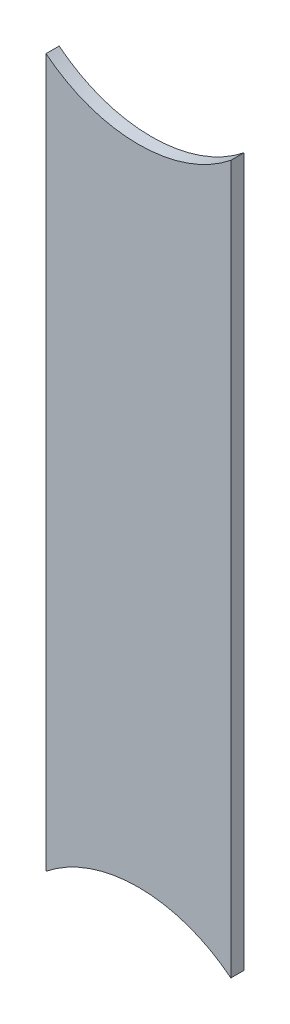
ISO-10303-21;
HEADER;
FILE_DESCRIPTION(('STEP AP214'),'2;1');
FILE_NAME('part.step','',(''),(''),'','','');
FILE_SCHEMA(('AUTOMOTIVE_DESIGN { 1 0 10303 214 1 1 1 1 }'));
ENDSEC;
DATA;
#1=APPLICATION_CONTEXT('core data for automotive mechanical design processes');
#2=APPLICATION_PROTOCOL_DEFINITION('international standard','automotive_design',2000,#1);
#3=PRODUCT_CONTEXT('',#1,'mechanical');
#4=PRODUCT('Part','Part','',(#3));
#5=PRODUCT_RELATED_PRODUCT_CATEGORY('part','',(#4));
#6=PRODUCT_DEFINITION_FORMATION('','',#4);
#7=PRODUCT_DEFINITION_CONTEXT('part definition',#1,'design');
#8=PRODUCT_DEFINITION('design','',#6,#7);
#9=PRODUCT_DEFINITION_SHAPE('','',#8);
#10=(LENGTH_UNIT() NAMED_UNIT(*) SI_UNIT(.MILLI.,.METRE.));
#11=(NAMED_UNIT(*) PLANE_ANGLE_UNIT() SI_UNIT($,.RADIAN.));
#12=(NAMED_UNIT(*) SI_UNIT($,.STERADIAN.) SOLID_ANGLE_UNIT());
#13=UNCERTAINTY_MEASURE_WITH_UNIT(LENGTH_MEASURE(1.E-05),#10,'distance_accuracy_value','');
#14=(GEOMETRIC_REPRESENTATION_CONTEXT(3) GLOBAL_UNCERTAINTY_ASSIGNED_CONTEXT((#13)) GLOBAL_UNIT_ASSIGNED_CONTEXT((#10,
#11,#12)) REPRESENTATION_CONTEXT('',''));
#15=CARTESIAN_POINT('',(0.,0.,0.));
#16=DIRECTION('',(0.,0.,1.));
#17=DIRECTION('',(1.,0.,0.));
#18=AXIS2_PLACEMENT_3D('',#15,#16,#17);
#19=CARTESIAN_POINT('',(78.3400135,99.5022464754201,0.));
#20=DIRECTION('',(-1.,0.,0.));
#21=DIRECTION('',(0.,1.,0.));
#22=AXIS2_PLACEMENT_3D('',#19,#20,#21);
#23=PLANE('',#22);
#24=DIRECTION('',(0.,1.,0.));
#25=VECTOR('',#24,1.);
#26=CARTESIAN_POINT('',(78.3400135,99.1899972,0.03556));
#27=LINE('',#26,#25);
#28=CARTESIAN_POINT('',(78.3400135,99.5022464754201,0.03556));
#29=VERTEX_POINT('',#28);
#30=CARTESIAN_POINT('',(78.3400135,101.41774792458,0.03556));
#31=VERTEX_POINT('',#30);
#32=EDGE_CURVE('E11',#29,#31,#27,.T.);
#33=ORIENTED_EDGE('',*,*,#32,.F.);
#34=DIRECTION('',(0.,0.,1.));
#35=VECTOR('',#34,1.);
#36=CARTESIAN_POINT('',(78.3400135,99.5022464754201,0.));
#37=LINE('',#36,#35);
#38=CARTESIAN_POINT('',(78.3400135,99.5022464754201,0.));
#39=VERTEX_POINT('',#38);
#40=EDGE_CURVE('E24',#39,#29,#37,.T.);
#41=ORIENTED_EDGE('',*,*,#40,.F.);
#42=DIRECTION('',(0.,1.,0.));
#43=VECTOR('',#42,1.);
#44=CARTESIAN_POINT('',(78.3400135,99.1899972,0.));
#45=LINE('',#44,#43);
#46=CARTESIAN_POINT('',(78.3400135,101.41774792458,0.));
#47=VERTEX_POINT('',#46);
#48=EDGE_CURVE('E75',#39,#47,#45,.T.);
#49=ORIENTED_EDGE('',*,*,#48,.T.);
#50=DIRECTION('',(0.,0.,1.));
#51=VECTOR('',#50,1.);
#52=CARTESIAN_POINT('',(78.3400135,101.41774792458,0.));
#53=LINE('',#52,#51);
#54=EDGE_CURVE('E37',#47,#31,#53,.T.);
#55=ORIENTED_EDGE('',*,*,#54,.T.);
#56=EDGE_LOOP('',(#33,#41,#49,#55));
#57=FACE_BOUND('',#56,.T.);
#58=ADVANCED_FACE('F17',(#57),#23,.F.);
#59=CARTESIAN_POINT('',(78.090014,101.7299972,0.));
#60=DIRECTION('',(0.,0.,-1.));
#61=DIRECTION('',(1.,0.,0.));
#62=AXIS2_PLACEMENT_3D('',#59,#60,#61);
#63=CYLINDRICAL_SURFACE('',#62,0.3999992);
#64=DIRECTION('',(0.,0.,1.));
#65=VECTOR('',#64,1.);
#66=CARTESIAN_POINT('',(77.8400145,101.41774792458,0.));
#67=LINE('',#66,#65);
#68=CARTESIAN_POINT('',(77.8400145,101.41774792458,0.));
#69=VERTEX_POINT('',#68);
#70=CARTESIAN_POINT('',(77.8400145,101.41774792458,0.03556));
#71=VERTEX_POINT('',#70);
#72=EDGE_CURVE('E67',#69,#71,#67,.T.);
#73=ORIENTED_EDGE('',*,*,#72,.T.);
#74=CARTESIAN_POINT('',(78.090014,101.7299972,0.03556));
#75=DIRECTION('',(0.,0.,1.));
#76=DIRECTION('',(1.,0.,0.));
#77=AXIS2_PLACEMENT_3D('',#74,#75,#76);
#78=CIRCLE('',#77,0.3999992);
#79=EDGE_CURVE('E82',#71,#31,#78,.T.);
#80=ORIENTED_EDGE('',*,*,#79,.T.);
#81=ORIENTED_EDGE('',*,*,#54,.F.);
#82=CARTESIAN_POINT('',(78.090014,101.7299972,0.));
#83=DIRECTION('',(0.,0.,1.));
#84=DIRECTION('',(1.,0.,0.));
#85=AXIS2_PLACEMENT_3D('',#82,#83,#84);
#86=CIRCLE('',#85,0.3999992);
#87=EDGE_CURVE('E80',#69,#47,#86,.T.);
#88=ORIENTED_EDGE('',*,*,#87,.F.);
#89=EDGE_LOOP('',(#73,#80,#81,#88));
#90=FACE_BOUND('',#89,.T.);
#91=ADVANCED_FACE('F88',(#90),#63,.F.);
#92=CARTESIAN_POINT('',(77.8400145,101.41774792458,0.));
#93=DIRECTION('',(1.,0.,0.));
#94=DIRECTION('',(0.,-1.,0.));
#95=AXIS2_PLACEMENT_3D('',#92,#93,#94);
#96=PLANE('',#95);
#97=DIRECTION('',(0.,-1.,0.));
#98=VECTOR('',#97,1.);
#99=CARTESIAN_POINT('',(77.8400145,101.7299972,0.03556));
#100=LINE('',#99,#98);
#101=CARTESIAN_POINT('',(77.8400145,99.5022464754201,0.03556));
#102=VERTEX_POINT('',#101);
#103=EDGE_CURVE('E71',#71,#102,#100,.T.);
#104=ORIENTED_EDGE('',*,*,#103,.F.);
#105=ORIENTED_EDGE('',*,*,#72,.F.);
#106=DIRECTION('',(0.,-1.,0.));
#107=VECTOR('',#106,1.);
#108=CARTESIAN_POINT('',(77.8400145,101.7299972,0.));
#109=LINE('',#108,#107);
#110=CARTESIAN_POINT('',(77.8400145,99.5022464754201,0.));
#111=VERTEX_POINT('',#110);
#112=EDGE_CURVE('E63',#69,#111,#109,.T.);
#113=ORIENTED_EDGE('',*,*,#112,.T.);
#114=DIRECTION('',(0.,0.,1.));
#115=VECTOR('',#114,1.);
#116=CARTESIAN_POINT('',(77.8400145,99.5022464754201,0.));
#117=LINE('',#116,#115);
#118=EDGE_CURVE('E53',#111,#102,#117,.T.);
#119=ORIENTED_EDGE('',*,*,#118,.T.);
#120=EDGE_LOOP('',(#104,#105,#113,#119));
#121=FACE_BOUND('',#120,.T.);
#122=ADVANCED_FACE('F66',(#121),#96,.F.);
#123=CARTESIAN_POINT('',(78.090014,99.1899972,0.));
#124=DIRECTION('',(0.,0.,-1.));
#125=DIRECTION('',(1.,0.,0.));
#126=AXIS2_PLACEMENT_3D('',#123,#124,#125);
#127=CYLINDRICAL_SURFACE('',#126,0.3999992);
#128=ORIENTED_EDGE('',*,*,#40,.T.);
#129=CARTESIAN_POINT('',(78.090014,99.1899972,0.03556));
#130=DIRECTION('',(0.,0.,1.));
#131=DIRECTION('',(1.,0.,0.));
#132=AXIS2_PLACEMENT_3D('',#129,#130,#131);
#133=CIRCLE('',#132,0.3999992);
#134=EDGE_CURVE('E59',#29,#102,#133,.T.);
#135=ORIENTED_EDGE('',*,*,#134,.T.);
#136=ORIENTED_EDGE('',*,*,#118,.F.);
#137=CARTESIAN_POINT('',(78.090014,99.1899972,0.));
#138=DIRECTION('',(0.,0.,1.));
#139=DIRECTION('',(1.,0.,0.));
#140=AXIS2_PLACEMENT_3D('',#137,#138,#139);
#141=CIRCLE('',#140,0.3999992);
#142=EDGE_CURVE('E57',#39,#111,#141,.T.);
#143=ORIENTED_EDGE('',*,*,#142,.F.);
#144=EDGE_LOOP('',(#128,#135,#136,#143));
#145=FACE_BOUND('',#144,.T.);
#146=ADVANCED_FACE('F55',(#145),#127,.F.);
#147=CARTESIAN_POINT('',(78.3400135,99.1899972,0.));
#148=DIRECTION('',(0.,0.,-1.));
#149=DIRECTION('',(-1.,0.,0.));
#150=AXIS2_PLACEMENT_3D('',#147,#148,#149);
#151=PLANE('',#150);
#152=ORIENTED_EDGE('',*,*,#48,.F.);
#153=ORIENTED_EDGE('',*,*,#142,.T.);
#154=ORIENTED_EDGE('',*,*,#112,.F.);
#155=ORIENTED_EDGE('',*,*,#87,.T.);
#156=EDGE_LOOP('',(#152,#153,#154,#155));
#157=FACE_BOUND('',#156,.T.);
#158=ADVANCED_FACE('F74',(#157),#151,.T.);
#159=CARTESIAN_POINT('',(78.3400135,99.1899972,0.03556));
#160=DIRECTION('',(0.,0.,-1.));
#161=DIRECTION('',(-1.,0.,0.));
#162=AXIS2_PLACEMENT_3D('',#159,#160,#161);
#163=PLANE('',#162);
#164=ORIENTED_EDGE('',*,*,#134,.F.);
#165=ORIENTED_EDGE('',*,*,#32,.T.);
#166=ORIENTED_EDGE('',*,*,#79,.F.);
#167=ORIENTED_EDGE('',*,*,#103,.T.);
#168=EDGE_LOOP('',(#164,#165,#166,#167));
#169=FACE_BOUND('',#168,.T.);
#170=ADVANCED_FACE('F91',(#169),#163,.F.);
#171=CLOSED_SHELL('',(#58,#91,#122,#146,#158,#170));
#172=MANIFOLD_SOLID_BREP('B1',#171);
#173=ADVANCED_BREP_SHAPE_REPRESENTATION('',(#18,#172),#14);
#174=SHAPE_DEFINITION_REPRESENTATION(#9,#173);
ENDSEC;
END-ISO-10303-21;
